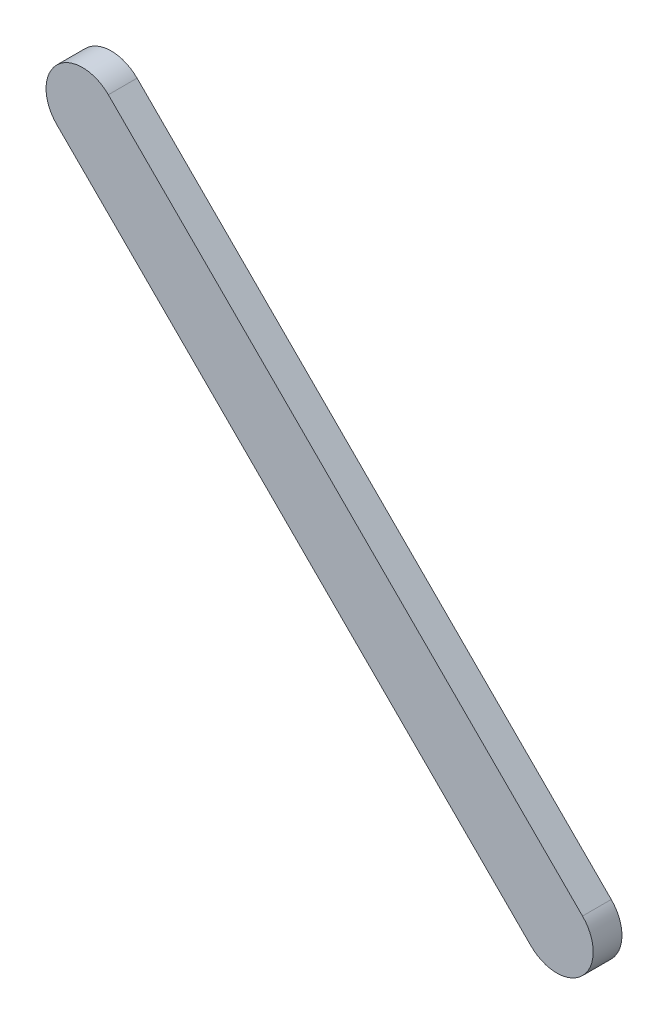
ISO-10303-21;
HEADER;
FILE_DESCRIPTION(('STEP AP214'),'2;1');
FILE_NAME('part.step','',(''),(''),'','','');
FILE_SCHEMA(('AUTOMOTIVE_DESIGN { 1 0 10303 214 1 1 1 1 }'));
ENDSEC;
DATA;
#1=APPLICATION_CONTEXT('core data for automotive mechanical design processes');
#2=APPLICATION_PROTOCOL_DEFINITION('international standard','automotive_design',2000,#1);
#3=PRODUCT_CONTEXT('',#1,'mechanical');
#4=PRODUCT('Part','Part','',(#3));
#5=PRODUCT_RELATED_PRODUCT_CATEGORY('part','',(#4));
#6=PRODUCT_DEFINITION_FORMATION('','',#4);
#7=PRODUCT_DEFINITION_CONTEXT('part definition',#1,'design');
#8=PRODUCT_DEFINITION('design','',#6,#7);
#9=PRODUCT_DEFINITION_SHAPE('','',#8);
#10=(LENGTH_UNIT() NAMED_UNIT(*) SI_UNIT(.MILLI.,.METRE.));
#11=(NAMED_UNIT(*) PLANE_ANGLE_UNIT() SI_UNIT($,.RADIAN.));
#12=(NAMED_UNIT(*) SI_UNIT($,.STERADIAN.) SOLID_ANGLE_UNIT());
#13=UNCERTAINTY_MEASURE_WITH_UNIT(LENGTH_MEASURE(1.E-05),#10,'distance_accuracy_value','');
#14=(GEOMETRIC_REPRESENTATION_CONTEXT(3) GLOBAL_UNCERTAINTY_ASSIGNED_CONTEXT((#13)) GLOBAL_UNIT_ASSIGNED_CONTEXT((#10,
#11,#12)) REPRESENTATION_CONTEXT('',''));
#15=CARTESIAN_POINT('',(0.,0.,0.));
#16=DIRECTION('',(0.,0.,1.));
#17=DIRECTION('',(1.,0.,0.));
#18=AXIS2_PLACEMENT_3D('',#15,#16,#17);
#19=CARTESIAN_POINT('',(152.09339406,120.85139406,0.));
#20=DIRECTION('',(0.707106781186549,0.707106781186546,0.));
#21=DIRECTION('',(0.707106781186546,-0.707106781186549,0.));
#22=AXIS2_PLACEMENT_3D('',#19,#20,#21);
#23=PLANE('',#22);
#24=DIRECTION('',(0.707106781186546,-0.707106781186549,0.));
#25=VECTOR('',#24,1.);
#26=CARTESIAN_POINT('',(152.09339406,120.85139406,0.1999996));
#27=LINE('',#26,#25);
#28=CARTESIAN_POINT('',(152.09339406,120.85139406,0.1999996));
#29=VERTEX_POINT('',#28);
#30=CARTESIAN_POINT('',(155.39539406,117.54939406,0.1999996));
#31=VERTEX_POINT('',#30);
#32=EDGE_CURVE('E11',#29,#31,#27,.T.);
#33=ORIENTED_EDGE('',*,*,#32,.F.);
#34=DIRECTION('',(0.,0.,1.));
#35=VECTOR('',#34,1.);
#36=CARTESIAN_POINT('',(152.09339406,120.85139406,0.));
#37=LINE('',#36,#35);
#38=CARTESIAN_POINT('',(152.09339406,120.85139406,0.));
#39=VERTEX_POINT('',#38);
#40=EDGE_CURVE('E24',#39,#29,#37,.T.);
#41=ORIENTED_EDGE('',*,*,#40,.F.);
#42=DIRECTION('',(0.707106781186546,-0.707106781186549,0.));
#43=VECTOR('',#42,1.);
#44=CARTESIAN_POINT('',(152.09339406,120.85139406,0.));
#45=LINE('',#44,#43);
#46=CARTESIAN_POINT('',(155.39539406,117.54939406,0.));
#47=VERTEX_POINT('',#46);
#48=EDGE_CURVE('E75',#39,#47,#45,.T.);
#49=ORIENTED_EDGE('',*,*,#48,.T.);
#50=DIRECTION('',(0.,0.,1.));
#51=VECTOR('',#50,1.);
#52=CARTESIAN_POINT('',(155.39539406,117.54939406,0.));
#53=LINE('',#52,#51);
#54=EDGE_CURVE('E37',#47,#31,#53,.T.);
#55=ORIENTED_EDGE('',*,*,#54,.T.);
#56=EDGE_LOOP('',(#33,#41,#49,#55));
#57=FACE_BOUND('',#56,.T.);
#58=ADVANCED_FACE('F17',(#57),#23,.F.);
#59=CARTESIAN_POINT('',(155.575,117.729,0.));
#60=DIRECTION('',(0.,0.,-1.));
#61=DIRECTION('',(-0.707106781186576,-0.70710678118652,0.));
#62=AXIS2_PLACEMENT_3D('',#59,#60,#61);
#63=CYLINDRICAL_SURFACE('',#62,0.254001156230781);
#64=CARTESIAN_POINT('',(155.575,117.729,0.1999996));
#65=DIRECTION('',(0.,0.,1.));
#66=DIRECTION('',(-0.707106781186576,-0.70710678118652,0.));
#67=AXIS2_PLACEMENT_3D('',#64,#65,#66);
#68=CIRCLE('',#67,0.254001156230781);
#69=CARTESIAN_POINT('',(155.75460594,117.90860594,0.1999996));
#70=VERTEX_POINT('',#69);
#71=EDGE_CURVE('E83',#31,#70,#68,.T.);
#72=ORIENTED_EDGE('',*,*,#71,.F.);
#73=ORIENTED_EDGE('',*,*,#54,.F.);
#74=CARTESIAN_POINT('',(155.575,117.729,0.));
#75=DIRECTION('',(0.,0.,1.));
#76=DIRECTION('',(-0.707106781186576,-0.70710678118652,0.));
#77=AXIS2_PLACEMENT_3D('',#74,#75,#76);
#78=CIRCLE('',#77,0.254001156230781);
#79=CARTESIAN_POINT('',(155.75460594,117.90860594,0.));
#80=VERTEX_POINT('',#79);
#81=EDGE_CURVE('E81',#47,#80,#78,.T.);
#82=ORIENTED_EDGE('',*,*,#81,.T.);
#83=DIRECTION('',(0.,0.,1.));
#84=VECTOR('',#83,1.);
#85=CARTESIAN_POINT('',(155.75460594,117.90860594,0.));
#86=LINE('',#85,#84);
#87=EDGE_CURVE('E67',#80,#70,#86,.T.);
#88=ORIENTED_EDGE('',*,*,#87,.T.);
#89=EDGE_LOOP('',(#72,#73,#82,#88));
#90=FACE_BOUND('',#89,.T.);
#91=ADVANCED_FACE('F89',(#90),#63,.T.);
#92=CARTESIAN_POINT('',(155.75460594,117.90860594,0.));
#93=DIRECTION('',(-0.707106781186546,-0.707106781186549,0.));
#94=DIRECTION('',(-0.707106781186549,0.707106781186546,0.));
#95=AXIS2_PLACEMENT_3D('',#92,#93,#94);
#96=PLANE('',#95);
#97=DIRECTION('',(-0.707106781186549,0.707106781186546,0.));
#98=VECTOR('',#97,1.);
#99=CARTESIAN_POINT('',(155.75460594,117.90860594,0.1999996));
#100=LINE('',#99,#98);
#101=CARTESIAN_POINT('',(152.45260594,121.21060594,0.1999996));
#102=VERTEX_POINT('',#101);
#103=EDGE_CURVE('E71',#70,#102,#100,.T.);
#104=ORIENTED_EDGE('',*,*,#103,.F.);
#105=ORIENTED_EDGE('',*,*,#87,.F.);
#106=DIRECTION('',(-0.707106781186549,0.707106781186546,0.));
#107=VECTOR('',#106,1.);
#108=CARTESIAN_POINT('',(155.75460594,117.90860594,0.));
#109=LINE('',#108,#107);
#110=CARTESIAN_POINT('',(152.45260594,121.21060594,0.));
#111=VERTEX_POINT('',#110);
#112=EDGE_CURVE('E63',#80,#111,#109,.T.);
#113=ORIENTED_EDGE('',*,*,#112,.T.);
#114=DIRECTION('',(0.,0.,1.));
#115=VECTOR('',#114,1.);
#116=CARTESIAN_POINT('',(152.45260594,121.21060594,0.));
#117=LINE('',#116,#115);
#118=EDGE_CURVE('E53',#111,#102,#117,.T.);
#119=ORIENTED_EDGE('',*,*,#118,.T.);
#120=EDGE_LOOP('',(#104,#105,#113,#119));
#121=FACE_BOUND('',#120,.T.);
#122=ADVANCED_FACE('F66',(#121),#96,.F.);
#123=CARTESIAN_POINT('',(152.273,121.031,0.));
#124=DIRECTION('',(0.,0.,-1.));
#125=DIRECTION('',(0.707106781186576,0.70710678118652,0.));
#126=AXIS2_PLACEMENT_3D('',#123,#124,#125);
#127=CYLINDRICAL_SURFACE('',#126,0.254001156230768);
#128=CARTESIAN_POINT('',(152.273,121.031,0.1999996));
#129=DIRECTION('',(0.,0.,1.));
#130=DIRECTION('',(0.707106781186576,0.70710678118652,0.));
#131=AXIS2_PLACEMENT_3D('',#128,#129,#130);
#132=CIRCLE('',#131,0.254001156230768);
#133=EDGE_CURVE('E59',#102,#29,#132,.T.);
#134=ORIENTED_EDGE('',*,*,#133,.F.);
#135=ORIENTED_EDGE('',*,*,#118,.F.);
#136=CARTESIAN_POINT('',(152.273,121.031,0.));
#137=DIRECTION('',(0.,0.,1.));
#138=DIRECTION('',(0.707106781186576,0.70710678118652,0.));
#139=AXIS2_PLACEMENT_3D('',#136,#137,#138);
#140=CIRCLE('',#139,0.254001156230768);
#141=EDGE_CURVE('E57',#111,#39,#140,.T.);
#142=ORIENTED_EDGE('',*,*,#141,.T.);
#143=ORIENTED_EDGE('',*,*,#40,.T.);
#144=EDGE_LOOP('',(#134,#135,#142,#143));
#145=FACE_BOUND('',#144,.T.);
#146=ADVANCED_FACE('F55',(#145),#127,.T.);
#147=CARTESIAN_POINT('',(152.09339406,120.85139406,0.));
#148=DIRECTION('',(0.,0.,-1.));
#149=DIRECTION('',(-1.,0.,0.));
#150=AXIS2_PLACEMENT_3D('',#147,#148,#149);
#151=PLANE('',#150);
#152=ORIENTED_EDGE('',*,*,#141,.F.);
#153=ORIENTED_EDGE('',*,*,#112,.F.);
#154=ORIENTED_EDGE('',*,*,#81,.F.);
#155=ORIENTED_EDGE('',*,*,#48,.F.);
#156=EDGE_LOOP('',(#152,#153,#154,#155));
#157=FACE_BOUND('',#156,.T.);
#158=ADVANCED_FACE('F74',(#157),#151,.T.);
#159=CARTESIAN_POINT('',(152.09339406,120.85139406,0.1999996));
#160=DIRECTION('',(0.,0.,-1.));
#161=DIRECTION('',(-1.,0.,0.));
#162=AXIS2_PLACEMENT_3D('',#159,#160,#161);
#163=PLANE('',#162);
#164=ORIENTED_EDGE('',*,*,#32,.T.);
#165=ORIENTED_EDGE('',*,*,#71,.T.);
#166=ORIENTED_EDGE('',*,*,#103,.T.);
#167=ORIENTED_EDGE('',*,*,#133,.T.);
#168=EDGE_LOOP('',(#164,#165,#166,#167));
#169=FACE_BOUND('',#168,.T.);
#170=ADVANCED_FACE('F91',(#169),#163,.F.);
#171=CLOSED_SHELL('',(#58,#91,#122,#146,#158,#170));
#172=MANIFOLD_SOLID_BREP('B1',#171);
#173=ADVANCED_BREP_SHAPE_REPRESENTATION('',(#18,#172),#14);
#174=SHAPE_DEFINITION_REPRESENTATION(#9,#173);
ENDSEC;
END-ISO-10303-21;
